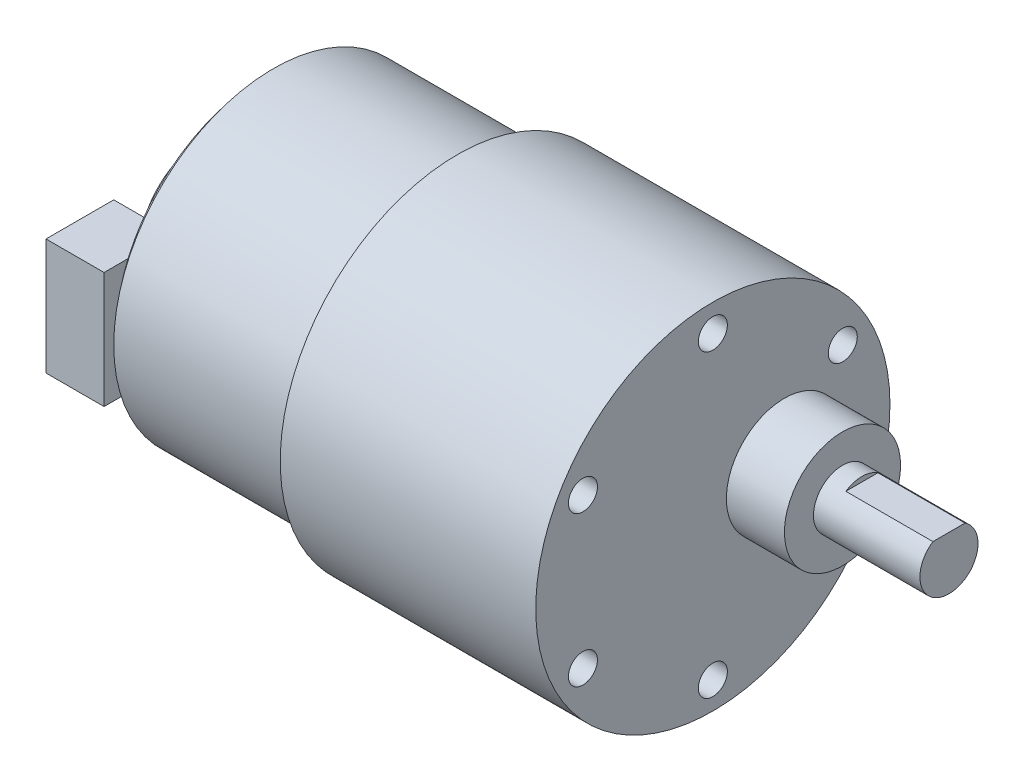
ISO-10303-21;
HEADER;
FILE_DESCRIPTION(('STEP AP214'),'2;1');
FILE_NAME('part.step','',(''),(''),'','','');
FILE_SCHEMA(('AUTOMOTIVE_DESIGN { 1 0 10303 214 1 1 1 1 }'));
ENDSEC;
DATA;
#1=APPLICATION_CONTEXT('core data for automotive mechanical design processes');
#2=APPLICATION_PROTOCOL_DEFINITION('international standard','automotive_design',2000,#1);
#3=PRODUCT_CONTEXT('',#1,'mechanical');
#4=PRODUCT('Part','Part','',(#3));
#5=PRODUCT_RELATED_PRODUCT_CATEGORY('part','',(#4));
#6=PRODUCT_DEFINITION_FORMATION('','',#4);
#7=PRODUCT_DEFINITION_CONTEXT('part definition',#1,'design');
#8=PRODUCT_DEFINITION('design','',#6,#7);
#9=PRODUCT_DEFINITION_SHAPE('','',#8);
#10=(LENGTH_UNIT() NAMED_UNIT(*) SI_UNIT(.MILLI.,.METRE.));
#11=(NAMED_UNIT(*) PLANE_ANGLE_UNIT() SI_UNIT($,.RADIAN.));
#12=(NAMED_UNIT(*) SI_UNIT($,.STERADIAN.) SOLID_ANGLE_UNIT());
#13=UNCERTAINTY_MEASURE_WITH_UNIT(LENGTH_MEASURE(1.E-05),#10,'distance_accuracy_value','');
#14=(GEOMETRIC_REPRESENTATION_CONTEXT(3) GLOBAL_UNCERTAINTY_ASSIGNED_CONTEXT((#13)) GLOBAL_UNIT_ASSIGNED_CONTEXT((#10,
#11,#12)) REPRESENTATION_CONTEXT('',''));
#15=CARTESIAN_POINT('',(0.,0.,0.));
#16=DIRECTION('',(0.,0.,1.));
#17=DIRECTION('',(1.,0.,0.));
#18=AXIS2_PLACEMENT_3D('',#15,#16,#17);
#19=CARTESIAN_POINT('',(-20.,0.,0.));
#20=DIRECTION('',(-1.,0.,0.));
#21=DIRECTION('',(0.,0.,1.));
#22=AXIS2_PLACEMENT_3D('',#19,#20,#21);
#23=PLANE('',#22);
#24=CARTESIAN_POINT('',(-20.,0.,0.));
#25=DIRECTION('',(-1.,0.,0.));
#26=DIRECTION('',(0.,0.,1.));
#27=AXIS2_PLACEMENT_3D('',#24,#25,#26);
#28=CIRCLE('',#27,6.9);
#29=CARTESIAN_POINT('',(-20.,0.,6.9));
#30=VERTEX_POINT('',#29);
#31=EDGE_CURVE('E233',#30,#30,#28,.T.);
#32=ORIENTED_EDGE('',*,*,#31,.F.);
#33=EDGE_LOOP('',(#32));
#34=FACE_BOUND('',#33,.T.);
#35=DIRECTION('',(0.,-1.,0.));
#36=VECTOR('',#35,1.);
#37=CARTESIAN_POINT('',(-20.,-6.,9.5));
#38=LINE('',#37,#36);
#39=CARTESIAN_POINT('',(-20.,6.,9.5));
#40=VERTEX_POINT('',#39);
#41=CARTESIAN_POINT('',(-20.,-6.,9.5));
#42=VERTEX_POINT('',#41);
#43=EDGE_CURVE('E209',#40,#42,#38,.T.);
#44=ORIENTED_EDGE('',*,*,#43,.F.);
#45=DIRECTION('',(0.,0.,1.));
#46=VECTOR('',#45,1.);
#47=CARTESIAN_POINT('',(-20.,6.,0.));
#48=LINE('',#47,#46);
#49=CARTESIAN_POINT('',(-20.,6.,14.02007489281));
#50=VERTEX_POINT('',#49);
#51=EDGE_CURVE('E44',#40,#50,#48,.T.);
#52=ORIENTED_EDGE('',*,*,#51,.T.);
#53=CARTESIAN_POINT('',(-20.,0.,0.));
#54=DIRECTION('',(-1.,0.,0.));
#55=DIRECTION('',(0.,0.,1.));
#56=AXIS2_PLACEMENT_3D('',#53,#54,#55);
#57=CIRCLE('',#56,15.25);
#58=CARTESIAN_POINT('',(-20.,-6.,14.02007489281));
#59=VERTEX_POINT('',#58);
#60=EDGE_CURVE('E238',#50,#59,#57,.T.);
#61=ORIENTED_EDGE('',*,*,#60,.T.);
#62=DIRECTION('',(0.,0.,1.));
#63=VECTOR('',#62,1.);
#64=CARTESIAN_POINT('',(-20.,-6.,9.5));
#65=LINE('',#64,#63);
#66=EDGE_CURVE('E192',#42,#59,#65,.T.);
#67=ORIENTED_EDGE('',*,*,#66,.F.);
#68=EDGE_LOOP('',(#44,#52,#61,#67));
#69=FACE_BOUND('',#68,.T.);
#70=ADVANCED_FACE('F40',(#34,#69),#23,.T.);
#71=CARTESIAN_POINT('',(26.4,0.,0.));
#72=DIRECTION('',(-1.,0.,0.));
#73=DIRECTION('',(0.,0.,1.));
#74=AXIS2_PLACEMENT_3D('',#71,#72,#73);
#75=CYLINDRICAL_SURFACE('',#74,18.3);
#76=CARTESIAN_POINT('',(26.4,0.,0.));
#77=DIRECTION('',(1.,0.,0.));
#78=DIRECTION('',(0.,0.,-1.));
#79=AXIS2_PLACEMENT_3D('',#76,#77,#78);
#80=CIRCLE('',#79,18.3);
#81=CARTESIAN_POINT('',(26.4,0.,-18.3));
#82=VERTEX_POINT('',#81);
#83=EDGE_CURVE('E254',#82,#82,#80,.T.);
#84=ORIENTED_EDGE('',*,*,#83,.F.);
#85=EDGE_LOOP('',(#84));
#86=FACE_BOUND('',#85,.T.);
#87=CARTESIAN_POINT('',(0.,0.,0.));
#88=DIRECTION('',(1.,0.,0.));
#89=DIRECTION('',(0.,0.,-1.));
#90=AXIS2_PLACEMENT_3D('',#87,#88,#89);
#91=CIRCLE('',#90,18.3);
#92=CARTESIAN_POINT('',(0.,0.,-18.3));
#93=VERTEX_POINT('',#92);
#94=EDGE_CURVE('E250',#93,#93,#91,.T.);
#95=ORIENTED_EDGE('',*,*,#94,.T.);
#96=EDGE_LOOP('',(#95));
#97=FACE_BOUND('',#96,.T.);
#98=ADVANCED_FACE('F42',(#86,#97),#75,.T.);
#99=CARTESIAN_POINT('',(26.4,0.,0.));
#100=DIRECTION('',(1.,0.,0.));
#101=DIRECTION('',(0.,0.,-1.));
#102=AXIS2_PLACEMENT_3D('',#99,#100,#101);
#103=PLANE('',#102);
#104=CARTESIAN_POINT('',(26.4,0.,-7.39614994934144));
#105=DIRECTION('',(1.,0.,0.));
#106=DIRECTION('',(0.,0.,-1.));
#107=AXIS2_PLACEMENT_3D('',#104,#105,#106);
#108=CIRCLE('',#107,6.);
#109=CARTESIAN_POINT('',(26.4,0.,-13.3961499493414));
#110=VERTEX_POINT('',#109);
#111=EDGE_CURVE('E126',#110,#110,#108,.T.);
#112=ORIENTED_EDGE('',*,*,#111,.F.);
#113=EDGE_LOOP('',(#112));
#114=FACE_BOUND('',#113,.T.);
#115=CARTESIAN_POINT('',(26.4,15.5000000000001,2.49843971081276E-13));
#116=DIRECTION('',(1.,0.,0.));
#117=DIRECTION('',(0.,0.,-1.));
#118=AXIS2_PLACEMENT_3D('',#115,#116,#117);
#119=CIRCLE('',#118,1.50000000000001);
#120=CARTESIAN_POINT('',(26.4,15.5000000000001,-1.49999999999976));
#121=VERTEX_POINT('',#120);
#122=EDGE_CURVE('E172',#121,#121,#119,.T.);
#123=ORIENTED_EDGE('',*,*,#122,.F.);
#124=EDGE_LOOP('',(#123));
#125=FACE_BOUND('',#124,.T.);
#126=CARTESIAN_POINT('',(26.4,7.75000000000026,-13.4233937586594));
#127=DIRECTION('',(1.,0.,0.));
#128=DIRECTION('',(0.,0.,-1.));
#129=AXIS2_PLACEMENT_3D('',#126,#127,#128);
#130=CIRCLE('',#129,1.49999999999935);
#131=CARTESIAN_POINT('',(26.4,7.75000000000026,-14.9233937586588));
#132=VERTEX_POINT('',#131);
#133=EDGE_CURVE('E164',#132,#132,#130,.T.);
#134=ORIENTED_EDGE('',*,*,#133,.F.);
#135=EDGE_LOOP('',(#134));
#136=FACE_BOUND('',#135,.T.);
#137=CARTESIAN_POINT('',(26.4,-7.75000000000041,-13.42339375866));
#138=DIRECTION('',(1.,0.,0.));
#139=DIRECTION('',(0.,0.,-1.));
#140=AXIS2_PLACEMENT_3D('',#137,#138,#139);
#141=CIRCLE('',#140,1.49999999999888);
#142=CARTESIAN_POINT('',(26.4,-7.75000000000041,-14.9233937586589));
#143=VERTEX_POINT('',#142);
#144=EDGE_CURVE('E156',#143,#143,#141,.T.);
#145=ORIENTED_EDGE('',*,*,#144,.F.);
#146=EDGE_LOOP('',(#145));
#147=FACE_BOUND('',#146,.T.);
#148=CARTESIAN_POINT('',(26.4,-15.5000000000012,-8.8644904428813E-13));
#149=DIRECTION('',(1.,0.,0.));
#150=DIRECTION('',(0.,0.,-1.));
#151=AXIS2_PLACEMENT_3D('',#148,#149,#150);
#152=CIRCLE('',#151,1.49999999999904);
#153=CARTESIAN_POINT('',(26.4,-15.5000000000012,-1.49999999999992));
#154=VERTEX_POINT('',#153);
#155=EDGE_CURVE('E148',#154,#154,#152,.T.);
#156=ORIENTED_EDGE('',*,*,#155,.F.);
#157=EDGE_LOOP('',(#156));
#158=FACE_BOUND('',#157,.T.);
#159=CARTESIAN_POINT('',(26.4,-7.75000000000139,13.4233937586588));
#160=DIRECTION('',(1.,0.,0.));
#161=DIRECTION('',(0.,0.,-1.));
#162=AXIS2_PLACEMENT_3D('',#159,#160,#161);
#163=CIRCLE('',#162,1.49999999999967);
#164=CARTESIAN_POINT('',(26.4,-7.75000000000139,11.9233937586591));
#165=VERTEX_POINT('',#164);
#166=EDGE_CURVE('E139',#165,#165,#163,.T.);
#167=ORIENTED_EDGE('',*,*,#166,.F.);
#168=EDGE_LOOP('',(#167));
#169=FACE_BOUND('',#168,.T.);
#170=CARTESIAN_POINT('',(26.4,7.74999999999928,13.4233937586593));
#171=DIRECTION('',(1.,0.,0.));
#172=DIRECTION('',(0.,0.,-1.));
#173=AXIS2_PLACEMENT_3D('',#170,#171,#172);
#174=CIRCLE('',#173,1.50000000000014);
#175=CARTESIAN_POINT('',(26.4,7.74999999999928,11.9233937586592));
#176=VERTEX_POINT('',#175);
#177=EDGE_CURVE('E143',#176,#176,#174,.T.);
#178=ORIENTED_EDGE('',*,*,#177,.F.);
#179=EDGE_LOOP('',(#178));
#180=FACE_BOUND('',#179,.T.);
#181=ORIENTED_EDGE('',*,*,#83,.T.);
#182=EDGE_LOOP('',(#181));
#183=FACE_BOUND('',#182,.T.);
#184=ADVANCED_FACE('F265',(#114,#125,#136,#147,#158,#169,#180,#183),#103,.T.);
#185=CARTESIAN_POINT('',(0.,0.,0.));
#186=DIRECTION('',(1.,0.,0.));
#187=DIRECTION('',(0.,0.,-1.));
#188=AXIS2_PLACEMENT_3D('',#185,#186,#187);
#189=PLANE('',#188);
#190=CARTESIAN_POINT('',(0.,0.,0.));
#191=DIRECTION('',(-1.,0.,0.));
#192=DIRECTION('',(0.,0.,1.));
#193=AXIS2_PLACEMENT_3D('',#190,#191,#192);
#194=CIRCLE('',#193,16.5);
#195=CARTESIAN_POINT('',(0.,0.,16.5));
#196=VERTEX_POINT('',#195);
#197=EDGE_CURVE('E246',#196,#196,#194,.T.);
#198=ORIENTED_EDGE('',*,*,#197,.F.);
#199=EDGE_LOOP('',(#198));
#200=FACE_BOUND('',#199,.T.);
#201=ORIENTED_EDGE('',*,*,#94,.F.);
#202=EDGE_LOOP('',(#201));
#203=FACE_BOUND('',#202,.T.);
#204=ADVANCED_FACE('F262',(#200,#203),#189,.F.);
#205=CARTESIAN_POINT('',(-19.,0.,0.));
#206=DIRECTION('',(1.,0.,0.));
#207=DIRECTION('',(0.,0.,-1.));
#208=AXIS2_PLACEMENT_3D('',#205,#206,#207);
#209=CYLINDRICAL_SURFACE('',#208,16.5);
#210=CARTESIAN_POINT('',(-19.,0.,0.));
#211=DIRECTION('',(-1.,0.,0.));
#212=DIRECTION('',(0.,0.,1.));
#213=AXIS2_PLACEMENT_3D('',#210,#211,#212);
#214=CIRCLE('',#213,16.5);
#215=CARTESIAN_POINT('',(-19.,0.,16.5));
#216=VERTEX_POINT('',#215);
#217=EDGE_CURVE('E242',#216,#216,#214,.T.);
#218=ORIENTED_EDGE('',*,*,#217,.F.);
#219=EDGE_LOOP('',(#218));
#220=FACE_BOUND('',#219,.T.);
#221=ORIENTED_EDGE('',*,*,#197,.T.);
#222=EDGE_LOOP('',(#221));
#223=FACE_BOUND('',#222,.T.);
#224=ADVANCED_FACE('F264',(#220,#223),#209,.T.);
#225=CARTESIAN_POINT('',(-19.,0.,0.));
#226=DIRECTION('',(-1.,0.,0.));
#227=DIRECTION('',(0.,0.,1.));
#228=AXIS2_PLACEMENT_3D('',#225,#226,#227);
#229=PLANE('',#228);
#230=CARTESIAN_POINT('',(-19.,0.,0.));
#231=DIRECTION('',(-1.,0.,0.));
#232=DIRECTION('',(0.,0.,1.));
#233=AXIS2_PLACEMENT_3D('',#230,#231,#232);
#234=CIRCLE('',#233,15.25);
#235=CARTESIAN_POINT('',(-19.,0.,15.25));
#236=VERTEX_POINT('',#235);
#237=EDGE_CURVE('E237',#236,#236,#234,.T.);
#238=ORIENTED_EDGE('',*,*,#237,.F.);
#239=EDGE_LOOP('',(#238));
#240=FACE_BOUND('',#239,.T.);
#241=ORIENTED_EDGE('',*,*,#217,.T.);
#242=EDGE_LOOP('',(#241));
#243=FACE_BOUND('',#242,.T.);
#244=ADVANCED_FACE('F271',(#240,#243),#229,.T.);
#245=CARTESIAN_POINT('',(-20.,0.,0.));
#246=DIRECTION('',(1.,0.,0.));
#247=DIRECTION('',(0.,0.,-1.));
#248=AXIS2_PLACEMENT_3D('',#245,#246,#247);
#249=CYLINDRICAL_SURFACE('',#248,15.25);
#250=ORIENTED_EDGE('',*,*,#60,.F.);
#251=EDGE_CURVE('E232',#59,#50,#57,.T.);
#252=ORIENTED_EDGE('',*,*,#251,.F.);
#253=EDGE_LOOP('',(#250,#252));
#254=FACE_BOUND('',#253,.T.);
#255=ORIENTED_EDGE('',*,*,#237,.T.);
#256=EDGE_LOOP('',(#255));
#257=FACE_BOUND('',#256,.T.);
#258=ADVANCED_FACE('F290',(#254,#257),#249,.T.);
#259=CARTESIAN_POINT('',(-26.,0.,0.));
#260=DIRECTION('',(1.,0.,0.));
#261=DIRECTION('',(0.,0.,-1.));
#262=AXIS2_PLACEMENT_3D('',#259,#260,#261);
#263=CYLINDRICAL_SURFACE('',#262,6.9);
#264=CARTESIAN_POINT('',(-26.,0.,0.));
#265=DIRECTION('',(-1.,0.,0.));
#266=DIRECTION('',(0.,0.,1.));
#267=AXIS2_PLACEMENT_3D('',#264,#265,#266);
#268=CIRCLE('',#267,6.9);
#269=CARTESIAN_POINT('',(-26.,0.,6.9));
#270=VERTEX_POINT('',#269);
#271=EDGE_CURVE('E228',#270,#270,#268,.T.);
#272=ORIENTED_EDGE('',*,*,#271,.F.);
#273=EDGE_LOOP('',(#272));
#274=FACE_BOUND('',#273,.T.);
#275=ORIENTED_EDGE('',*,*,#31,.T.);
#276=EDGE_LOOP('',(#275));
#277=FACE_BOUND('',#276,.T.);
#278=ADVANCED_FACE('F288',(#274,#277),#263,.T.);
#279=CARTESIAN_POINT('',(-26.,0.,0.));
#280=DIRECTION('',(-1.,0.,0.));
#281=DIRECTION('',(0.,0.,1.));
#282=AXIS2_PLACEMENT_3D('',#279,#280,#281);
#283=PLANE('',#282);
#284=ORIENTED_EDGE('',*,*,#271,.T.);
#285=EDGE_LOOP('',(#284));
#286=FACE_BOUND('',#285,.T.);
#287=ADVANCED_FACE('F316',(#286),#283,.T.);
#288=CARTESIAN_POINT('',(-26.,-6.,16.5));
#289=DIRECTION('',(0.,0.,-1.));
#290=DIRECTION('',(-1.,0.,0.));
#291=AXIS2_PLACEMENT_3D('',#288,#289,#290);
#292=PLANE('',#291);
#293=DIRECTION('',(0.,1.,0.));
#294=VECTOR('',#293,1.);
#295=CARTESIAN_POINT('',(-20.,-6.,16.5));
#296=LINE('',#295,#294);
#297=CARTESIAN_POINT('',(-20.,-6.,16.5));
#298=VERTEX_POINT('',#297);
#299=CARTESIAN_POINT('',(-20.,6.,16.5));
#300=VERTEX_POINT('',#299);
#301=EDGE_CURVE('E183',#298,#300,#296,.T.);
#302=ORIENTED_EDGE('',*,*,#301,.T.);
#303=DIRECTION('',(1.,0.,0.));
#304=VECTOR('',#303,1.);
#305=CARTESIAN_POINT('',(-26.,6.,16.5));
#306=LINE('',#305,#304);
#307=CARTESIAN_POINT('',(-26.,6.,16.5));
#308=VERTEX_POINT('',#307);
#309=EDGE_CURVE('E224',#308,#300,#306,.T.);
#310=ORIENTED_EDGE('',*,*,#309,.F.);
#311=DIRECTION('',(0.,1.,0.));
#312=VECTOR('',#311,1.);
#313=CARTESIAN_POINT('',(-26.,-6.,16.5));
#314=LINE('',#313,#312);
#315=CARTESIAN_POINT('',(-26.,-6.,16.5));
#316=VERTEX_POINT('',#315);
#317=EDGE_CURVE('E187',#316,#308,#314,.T.);
#318=ORIENTED_EDGE('',*,*,#317,.F.);
#319=DIRECTION('',(1.,0.,0.));
#320=VECTOR('',#319,1.);
#321=CARTESIAN_POINT('',(-26.,-6.,16.5));
#322=LINE('',#321,#320);
#323=EDGE_CURVE('E201',#316,#298,#322,.T.);
#324=ORIENTED_EDGE('',*,*,#323,.T.);
#325=EDGE_LOOP('',(#302,#310,#318,#324));
#326=FACE_BOUND('',#325,.T.);
#327=ADVANCED_FACE('F323',(#326),#292,.F.);
#328=CARTESIAN_POINT('',(-26.,6.,9.5));
#329=DIRECTION('',(0.,-1.,0.));
#330=DIRECTION('',(0.,0.,-1.));
#331=AXIS2_PLACEMENT_3D('',#328,#329,#330);
#332=PLANE('',#331);
#333=DIRECTION('',(0.,0.,-1.));
#334=VECTOR('',#333,1.);
#335=CARTESIAN_POINT('',(-20.,6.,9.5));
#336=LINE('',#335,#334);
#337=EDGE_CURVE('E205',#300,#50,#336,.T.);
#338=ORIENTED_EDGE('',*,*,#337,.T.);
#339=ORIENTED_EDGE('',*,*,#51,.F.);
#340=DIRECTION('',(1.,0.,0.));
#341=VECTOR('',#340,1.);
#342=CARTESIAN_POINT('',(-26.,6.,9.5));
#343=LINE('',#342,#341);
#344=CARTESIAN_POINT('',(-26.,6.,9.5));
#345=VERTEX_POINT('',#344);
#346=EDGE_CURVE('E220',#345,#40,#343,.T.);
#347=ORIENTED_EDGE('',*,*,#346,.F.);
#348=DIRECTION('',(0.,0.,-1.));
#349=VECTOR('',#348,1.);
#350=CARTESIAN_POINT('',(-26.,6.,9.5));
#351=LINE('',#350,#349);
#352=EDGE_CURVE('E191',#308,#345,#351,.T.);
#353=ORIENTED_EDGE('',*,*,#352,.F.);
#354=ORIENTED_EDGE('',*,*,#309,.T.);
#355=EDGE_LOOP('',(#338,#339,#347,#353,#354));
#356=FACE_BOUND('',#355,.T.);
#357=ADVANCED_FACE('F329',(#356),#332,.F.);
#358=CARTESIAN_POINT('',(-26.,-6.,9.5));
#359=DIRECTION('',(0.,0.,1.));
#360=DIRECTION('',(1.,0.,0.));
#361=AXIS2_PLACEMENT_3D('',#358,#359,#360);
#362=PLANE('',#361);
#363=ORIENTED_EDGE('',*,*,#43,.T.);
#364=DIRECTION('',(1.,0.,0.));
#365=VECTOR('',#364,1.);
#366=CARTESIAN_POINT('',(-26.,-6.,9.5));
#367=LINE('',#366,#365);
#368=CARTESIAN_POINT('',(-26.,-6.,9.5));
#369=VERTEX_POINT('',#368);
#370=EDGE_CURVE('E64',#369,#42,#367,.T.);
#371=ORIENTED_EDGE('',*,*,#370,.F.);
#372=DIRECTION('',(0.,-1.,0.));
#373=VECTOR('',#372,1.);
#374=CARTESIAN_POINT('',(-26.,-6.,9.5));
#375=LINE('',#374,#373);
#376=EDGE_CURVE('E195',#345,#369,#375,.T.);
#377=ORIENTED_EDGE('',*,*,#376,.F.);
#378=ORIENTED_EDGE('',*,*,#346,.T.);
#379=EDGE_LOOP('',(#363,#371,#377,#378));
#380=FACE_BOUND('',#379,.T.);
#381=ADVANCED_FACE('F337',(#380),#362,.F.);
#382=CARTESIAN_POINT('',(-26.,-6.,9.5));
#383=DIRECTION('',(0.,1.,0.));
#384=DIRECTION('',(0.,0.,1.));
#385=AXIS2_PLACEMENT_3D('',#382,#383,#384);
#386=PLANE('',#385);
#387=ORIENTED_EDGE('',*,*,#66,.T.);
#388=EDGE_CURVE('E212',#59,#298,#65,.T.);
#389=ORIENTED_EDGE('',*,*,#388,.T.);
#390=ORIENTED_EDGE('',*,*,#323,.F.);
#391=DIRECTION('',(0.,0.,1.));
#392=VECTOR('',#391,1.);
#393=CARTESIAN_POINT('',(-26.,-6.,9.5));
#394=LINE('',#393,#392);
#395=EDGE_CURVE('E198',#369,#316,#394,.T.);
#396=ORIENTED_EDGE('',*,*,#395,.F.);
#397=ORIENTED_EDGE('',*,*,#370,.T.);
#398=EDGE_LOOP('',(#387,#389,#390,#396,#397));
#399=FACE_BOUND('',#398,.T.);
#400=ADVANCED_FACE('F345',(#399),#386,.F.);
#401=CARTESIAN_POINT('',(-26.,0.,0.));
#402=DIRECTION('',(1.,0.,0.));
#403=DIRECTION('',(0.,0.,-1.));
#404=AXIS2_PLACEMENT_3D('',#401,#402,#403);
#405=PLANE('',#404);
#406=ORIENTED_EDGE('',*,*,#317,.T.);
#407=ORIENTED_EDGE('',*,*,#352,.T.);
#408=ORIENTED_EDGE('',*,*,#376,.T.);
#409=ORIENTED_EDGE('',*,*,#395,.T.);
#410=EDGE_LOOP('',(#406,#407,#408,#409));
#411=FACE_BOUND('',#410,.T.);
#412=ADVANCED_FACE('F353',(#411),#405,.F.);
#413=CARTESIAN_POINT('',(-20.,0.,0.));
#414=DIRECTION('',(1.,0.,0.));
#415=DIRECTION('',(0.,0.,-1.));
#416=AXIS2_PLACEMENT_3D('',#413,#414,#415);
#417=PLANE('',#416);
#418=ORIENTED_EDGE('',*,*,#251,.T.);
#419=ORIENTED_EDGE('',*,*,#337,.F.);
#420=ORIENTED_EDGE('',*,*,#301,.F.);
#421=ORIENTED_EDGE('',*,*,#388,.F.);
#422=EDGE_LOOP('',(#418,#419,#420,#421));
#423=FACE_BOUND('',#422,.T.);
#424=ADVANCED_FACE('F360',(#423),#417,.T.);
#425=CARTESIAN_POINT('',(22.4,7.74999999999928,13.4233937586593));
#426=DIRECTION('',(1.,0.,0.));
#427=DIRECTION('',(0.,0.,-1.));
#428=AXIS2_PLACEMENT_3D('',#425,#426,#427);
#429=CYLINDRICAL_SURFACE('',#428,1.50000000000014);
#430=CARTESIAN_POINT('',(22.4,7.74999999999928,13.4233937586593));
#431=DIRECTION('',(1.,0.,0.));
#432=DIRECTION('',(0.,0.,-1.));
#433=AXIS2_PLACEMENT_3D('',#430,#431,#432);
#434=CIRCLE('',#433,1.50000000000014);
#435=CARTESIAN_POINT('',(22.4,7.74999999999928,11.9233937586592));
#436=VERTEX_POINT('',#435);
#437=EDGE_CURVE('E179',#436,#436,#434,.T.);
#438=ORIENTED_EDGE('',*,*,#437,.F.);
#439=EDGE_LOOP('',(#438));
#440=FACE_BOUND('',#439,.T.);
#441=ORIENTED_EDGE('',*,*,#177,.T.);
#442=EDGE_LOOP('',(#441));
#443=FACE_BOUND('',#442,.T.);
#444=ADVANCED_FACE('F368',(#440,#443),#429,.F.);
#445=CARTESIAN_POINT('',(22.4,0.,0.));
#446=DIRECTION('',(1.,0.,0.));
#447=DIRECTION('',(0.,0.,-1.));
#448=AXIS2_PLACEMENT_3D('',#445,#446,#447);
#449=PLANE('',#448);
#450=ORIENTED_EDGE('',*,*,#437,.T.);
#451=EDGE_LOOP('',(#450));
#452=FACE_BOUND('',#451,.T.);
#453=ADVANCED_FACE('F376',(#452),#449,.T.);
#454=CARTESIAN_POINT('',(22.4,-7.75000000000139,13.4233937586588));
#455=DIRECTION('',(1.,0.,0.));
#456=DIRECTION('',(0.,0.,-1.));
#457=AXIS2_PLACEMENT_3D('',#454,#455,#456);
#458=CYLINDRICAL_SURFACE('',#457,1.49999999999967);
#459=CARTESIAN_POINT('',(22.4,-7.75000000000139,13.4233937586588));
#460=DIRECTION('',(1.,0.,0.));
#461=DIRECTION('',(0.,0.,-1.));
#462=AXIS2_PLACEMENT_3D('',#459,#460,#461);
#463=CIRCLE('',#462,1.49999999999967);
#464=CARTESIAN_POINT('',(22.4,-7.75000000000139,11.9233937586591));
#465=VERTEX_POINT('',#464);
#466=EDGE_CURVE('E144',#465,#465,#463,.T.);
#467=ORIENTED_EDGE('',*,*,#466,.F.);
#468=EDGE_LOOP('',(#467));
#469=FACE_BOUND('',#468,.T.);
#470=ORIENTED_EDGE('',*,*,#166,.T.);
#471=EDGE_LOOP('',(#470));
#472=FACE_BOUND('',#471,.T.);
#473=ADVANCED_FACE('F384',(#469,#472),#458,.F.);
#474=CARTESIAN_POINT('',(22.4,0.,0.));
#475=DIRECTION('',(1.,0.,0.));
#476=DIRECTION('',(0.,0.,-1.));
#477=AXIS2_PLACEMENT_3D('',#474,#475,#476);
#478=PLANE('',#477);
#479=ORIENTED_EDGE('',*,*,#466,.T.);
#480=EDGE_LOOP('',(#479));
#481=FACE_BOUND('',#480,.T.);
#482=ADVANCED_FACE('F392',(#481),#478,.T.);
#483=CARTESIAN_POINT('',(22.4,-15.5000000000012,-8.8644904428813E-13));
#484=DIRECTION('',(1.,0.,0.));
#485=DIRECTION('',(0.,0.,-1.));
#486=AXIS2_PLACEMENT_3D('',#483,#484,#485);
#487=CYLINDRICAL_SURFACE('',#486,1.49999999999904);
#488=CARTESIAN_POINT('',(22.4,-15.5000000000012,-8.8644904428813E-13));
#489=DIRECTION('',(1.,0.,0.));
#490=DIRECTION('',(0.,0.,-1.));
#491=AXIS2_PLACEMENT_3D('',#488,#489,#490);
#492=CIRCLE('',#491,1.49999999999904);
#493=CARTESIAN_POINT('',(22.4,-15.5000000000012,-1.49999999999992));
#494=VERTEX_POINT('',#493);
#495=EDGE_CURVE('E152',#494,#494,#492,.T.);
#496=ORIENTED_EDGE('',*,*,#495,.F.);
#497=EDGE_LOOP('',(#496));
#498=FACE_BOUND('',#497,.T.);
#499=ORIENTED_EDGE('',*,*,#155,.T.);
#500=EDGE_LOOP('',(#499));
#501=FACE_BOUND('',#500,.T.);
#502=ADVANCED_FACE('F400',(#498,#501),#487,.F.);
#503=CARTESIAN_POINT('',(22.4,0.,0.));
#504=DIRECTION('',(1.,0.,0.));
#505=DIRECTION('',(0.,0.,-1.));
#506=AXIS2_PLACEMENT_3D('',#503,#504,#505);
#507=PLANE('',#506);
#508=ORIENTED_EDGE('',*,*,#495,.T.);
#509=EDGE_LOOP('',(#508));
#510=FACE_BOUND('',#509,.T.);
#511=ADVANCED_FACE('F408',(#510),#507,.T.);
#512=CARTESIAN_POINT('',(22.4,-7.75000000000041,-13.42339375866));
#513=DIRECTION('',(1.,0.,0.));
#514=DIRECTION('',(0.,0.,-1.));
#515=AXIS2_PLACEMENT_3D('',#512,#513,#514);
#516=CYLINDRICAL_SURFACE('',#515,1.49999999999888);
#517=CARTESIAN_POINT('',(22.4,-7.75000000000041,-13.42339375866));
#518=DIRECTION('',(1.,0.,0.));
#519=DIRECTION('',(0.,0.,-1.));
#520=AXIS2_PLACEMENT_3D('',#517,#518,#519);
#521=CIRCLE('',#520,1.49999999999888);
#522=CARTESIAN_POINT('',(22.4,-7.75000000000041,-14.9233937586589));
#523=VERTEX_POINT('',#522);
#524=EDGE_CURVE('E160',#523,#523,#521,.T.);
#525=ORIENTED_EDGE('',*,*,#524,.F.);
#526=EDGE_LOOP('',(#525));
#527=FACE_BOUND('',#526,.T.);
#528=ORIENTED_EDGE('',*,*,#144,.T.);
#529=EDGE_LOOP('',(#528));
#530=FACE_BOUND('',#529,.T.);
#531=ADVANCED_FACE('F416',(#527,#530),#516,.F.);
#532=CARTESIAN_POINT('',(22.4,0.,0.));
#533=DIRECTION('',(1.,0.,0.));
#534=DIRECTION('',(0.,0.,-1.));
#535=AXIS2_PLACEMENT_3D('',#532,#533,#534);
#536=PLANE('',#535);
#537=ORIENTED_EDGE('',*,*,#524,.T.);
#538=EDGE_LOOP('',(#537));
#539=FACE_BOUND('',#538,.T.);
#540=ADVANCED_FACE('F424',(#539),#536,.T.);
#541=CARTESIAN_POINT('',(22.4,7.75000000000026,-13.4233937586594));
#542=DIRECTION('',(1.,0.,0.));
#543=DIRECTION('',(0.,0.,-1.));
#544=AXIS2_PLACEMENT_3D('',#541,#542,#543);
#545=CYLINDRICAL_SURFACE('',#544,1.49999999999935);
#546=CARTESIAN_POINT('',(22.4,7.75000000000026,-13.4233937586594));
#547=DIRECTION('',(1.,0.,0.));
#548=DIRECTION('',(0.,0.,-1.));
#549=AXIS2_PLACEMENT_3D('',#546,#547,#548);
#550=CIRCLE('',#549,1.49999999999935);
#551=CARTESIAN_POINT('',(22.4,7.75000000000026,-14.9233937586588));
#552=VERTEX_POINT('',#551);
#553=EDGE_CURVE('E168',#552,#552,#550,.T.);
#554=ORIENTED_EDGE('',*,*,#553,.F.);
#555=EDGE_LOOP('',(#554));
#556=FACE_BOUND('',#555,.T.);
#557=ORIENTED_EDGE('',*,*,#133,.T.);
#558=EDGE_LOOP('',(#557));
#559=FACE_BOUND('',#558,.T.);
#560=ADVANCED_FACE('F432',(#556,#559),#545,.F.);
#561=CARTESIAN_POINT('',(22.4,0.,0.));
#562=DIRECTION('',(1.,0.,0.));
#563=DIRECTION('',(0.,0.,-1.));
#564=AXIS2_PLACEMENT_3D('',#561,#562,#563);
#565=PLANE('',#564);
#566=ORIENTED_EDGE('',*,*,#553,.T.);
#567=EDGE_LOOP('',(#566));
#568=FACE_BOUND('',#567,.T.);
#569=ADVANCED_FACE('F440',(#568),#565,.T.);
#570=CARTESIAN_POINT('',(22.4,15.5000000000001,2.49843971081276E-13));
#571=DIRECTION('',(1.,0.,0.));
#572=DIRECTION('',(0.,0.,-1.));
#573=AXIS2_PLACEMENT_3D('',#570,#571,#572);
#574=CYLINDRICAL_SURFACE('',#573,1.50000000000001);
#575=CARTESIAN_POINT('',(22.4,15.5000000000001,2.49843971081276E-13));
#576=DIRECTION('',(1.,0.,0.));
#577=DIRECTION('',(0.,0.,-1.));
#578=AXIS2_PLACEMENT_3D('',#575,#576,#577);
#579=CIRCLE('',#578,1.50000000000001);
#580=CARTESIAN_POINT('',(22.4,15.5000000000001,-1.49999999999976));
#581=VERTEX_POINT('',#580);
#582=EDGE_CURVE('E135',#581,#581,#579,.T.);
#583=ORIENTED_EDGE('',*,*,#582,.F.);
#584=EDGE_LOOP('',(#583));
#585=FACE_BOUND('',#584,.T.);
#586=ORIENTED_EDGE('',*,*,#122,.T.);
#587=EDGE_LOOP('',(#586));
#588=FACE_BOUND('',#587,.T.);
#589=ADVANCED_FACE('F448',(#585,#588),#574,.F.);
#590=CARTESIAN_POINT('',(22.4,15.5000000000001,2.49843971081276E-13));
#591=DIRECTION('',(1.,0.,0.));
#592=DIRECTION('',(0.,0.,-1.));
#593=AXIS2_PLACEMENT_3D('',#590,#591,#592);
#594=PLANE('',#593);
#595=ORIENTED_EDGE('',*,*,#582,.T.);
#596=EDGE_LOOP('',(#595));
#597=FACE_BOUND('',#596,.T.);
#598=ADVANCED_FACE('F456',(#597),#594,.T.);
#599=CARTESIAN_POINT('',(32.4,0.,-7.39614994934144));
#600=DIRECTION('',(-1.,0.,0.));
#601=DIRECTION('',(0.,0.,1.));
#602=AXIS2_PLACEMENT_3D('',#599,#600,#601);
#603=CYLINDRICAL_SURFACE('',#602,6.);
#604=CARTESIAN_POINT('',(32.4,0.,-7.39614994934144));
#605=DIRECTION('',(1.,0.,0.));
#606=DIRECTION('',(0.,0.,-1.));
#607=AXIS2_PLACEMENT_3D('',#604,#605,#606);
#608=CIRCLE('',#607,6.);
#609=CARTESIAN_POINT('',(32.4,0.,-13.3961499493414));
#610=VERTEX_POINT('',#609);
#611=EDGE_CURVE('E131',#610,#610,#608,.T.);
#612=ORIENTED_EDGE('',*,*,#611,.F.);
#613=EDGE_LOOP('',(#612));
#614=FACE_BOUND('',#613,.T.);
#615=ORIENTED_EDGE('',*,*,#111,.T.);
#616=EDGE_LOOP('',(#615));
#617=FACE_BOUND('',#616,.T.);
#618=ADVANCED_FACE('F464',(#614,#617),#603,.T.);
#619=CARTESIAN_POINT('',(32.4,0.,0.));
#620=DIRECTION('',(1.,0.,0.));
#621=DIRECTION('',(0.,0.,-1.));
#622=AXIS2_PLACEMENT_3D('',#619,#620,#621);
#623=PLANE('',#622);
#624=CARTESIAN_POINT('',(32.4,0.,-7.39614994934144));
#625=DIRECTION('',(1.,0.,0.));
#626=DIRECTION('',(0.,0.,-1.));
#627=AXIS2_PLACEMENT_3D('',#624,#625,#626);
#628=CIRCLE('',#627,3.);
#629=CARTESIAN_POINT('',(32.4,0.,-10.3961499493414));
#630=VERTEX_POINT('',#629);
#631=EDGE_CURVE('E11',#630,#630,#628,.T.);
#632=ORIENTED_EDGE('',*,*,#631,.F.);
#633=EDGE_LOOP('',(#632));
#634=FACE_BOUND('',#633,.T.);
#635=ORIENTED_EDGE('',*,*,#611,.T.);
#636=EDGE_LOOP('',(#635));
#637=FACE_BOUND('',#636,.T.);
#638=ADVANCED_FACE('F473',(#634,#637),#623,.T.);
#639=CARTESIAN_POINT('',(34.4,0.,-7.39614994934144));
#640=DIRECTION('',(-1.,0.,0.));
#641=DIRECTION('',(0.,0.,1.));
#642=AXIS2_PLACEMENT_3D('',#639,#640,#641);
#643=CYLINDRICAL_SURFACE('',#642,3.);
#644=CARTESIAN_POINT('',(34.4,0.,-7.39614994934144));
#645=DIRECTION('',(1.,0.,0.));
#646=DIRECTION('',(0.,0.,-1.));
#647=AXIS2_PLACEMENT_3D('',#644,#645,#646);
#648=CIRCLE('',#647,3.);
#649=CARTESIAN_POINT('',(34.4,2.50006684943398,-9.05436156079555));
#650=VERTEX_POINT('',#649);
#651=CARTESIAN_POINT('',(34.4,2.50006684943398,-5.73793833788734));
#652=VERTEX_POINT('',#651);
#653=EDGE_CURVE('E121',#650,#652,#648,.T.);
#654=ORIENTED_EDGE('',*,*,#653,.F.);
#655=DIRECTION('',(-1.,0.,0.));
#656=VECTOR('',#655,1.);
#657=CARTESIAN_POINT('',(43.4,2.50006684943398,-9.05436156079555));
#658=LINE('',#657,#656);
#659=CARTESIAN_POINT('',(43.4,2.50006684943398,-9.05436156079555));
#660=VERTEX_POINT('',#659);
#661=EDGE_CURVE('E107',#660,#650,#658,.T.);
#662=ORIENTED_EDGE('',*,*,#661,.F.);
#663=CARTESIAN_POINT('',(43.4,0.,-7.39614994934144));
#664=DIRECTION('',(1.,0.,0.));
#665=DIRECTION('',(0.,0.,-1.));
#666=AXIS2_PLACEMENT_3D('',#663,#664,#665);
#667=CIRCLE('',#666,3.);
#668=CARTESIAN_POINT('',(43.4,2.50006684943398,-5.73793833788734));
#669=VERTEX_POINT('',#668);
#670=EDGE_CURVE('E113',#669,#660,#667,.T.);
#671=ORIENTED_EDGE('',*,*,#670,.F.);
#672=DIRECTION('',(-1.,0.,0.));
#673=VECTOR('',#672,1.);
#674=CARTESIAN_POINT('',(43.4,2.50006684943398,-5.73793833788734));
#675=LINE('',#674,#673);
#676=EDGE_CURVE('E109',#669,#652,#675,.T.);
#677=ORIENTED_EDGE('',*,*,#676,.T.);
#678=EDGE_LOOP('',(#654,#662,#671,#677));
#679=FACE_BOUND('',#678,.T.);
#680=ORIENTED_EDGE('',*,*,#631,.T.);
#681=EDGE_LOOP('',(#680));
#682=FACE_BOUND('',#681,.T.);
#683=ADVANCED_FACE('F119',(#679,#682),#643,.T.);
#684=CARTESIAN_POINT('',(34.4,0.,-7.39614994934144));
#685=DIRECTION('',(1.,0.,0.));
#686=DIRECTION('',(0.,0.,-1.));
#687=AXIS2_PLACEMENT_3D('',#684,#685,#686);
#688=PLANE('',#687);
#689=DIRECTION('',(0.,0.,1.));
#690=VECTOR('',#689,1.);
#691=CARTESIAN_POINT('',(34.4,2.50006684943398,-5.73793833788734));
#692=LINE('',#691,#690);
#693=EDGE_CURVE('E56',#650,#652,#692,.T.);
#694=ORIENTED_EDGE('',*,*,#693,.F.);
#695=ORIENTED_EDGE('',*,*,#653,.T.);
#696=EDGE_LOOP('',(#694,#695));
#697=FACE_BOUND('',#696,.T.);
#698=ADVANCED_FACE('F488',(#697),#688,.T.);
#699=CARTESIAN_POINT('',(43.4,2.50006684943398,-5.73793833788734));
#700=DIRECTION('',(0.,-1.,0.));
#701=DIRECTION('',(0.,0.,-1.));
#702=AXIS2_PLACEMENT_3D('',#699,#700,#701);
#703=PLANE('',#702);
#704=ORIENTED_EDGE('',*,*,#693,.T.);
#705=ORIENTED_EDGE('',*,*,#676,.F.);
#706=DIRECTION('',(0.,0.,1.));
#707=VECTOR('',#706,1.);
#708=CARTESIAN_POINT('',(43.4,2.50006684943398,-5.73793833788734));
#709=LINE('',#708,#707);
#710=EDGE_CURVE('E103',#660,#669,#709,.T.);
#711=ORIENTED_EDGE('',*,*,#710,.F.);
#712=ORIENTED_EDGE('',*,*,#661,.T.);
#713=EDGE_LOOP('',(#704,#705,#711,#712));
#714=FACE_BOUND('',#713,.T.);
#715=ADVANCED_FACE('F105',(#714),#703,.F.);
#716=CARTESIAN_POINT('',(43.4,0.,-7.39614994934144));
#717=DIRECTION('',(1.,0.,0.));
#718=DIRECTION('',(0.,0.,-1.));
#719=AXIS2_PLACEMENT_3D('',#716,#717,#718);
#720=PLANE('',#719);
#721=ORIENTED_EDGE('',*,*,#670,.T.);
#722=ORIENTED_EDGE('',*,*,#710,.T.);
#723=EDGE_LOOP('',(#721,#722));
#724=FACE_BOUND('',#723,.T.);
#725=ADVANCED_FACE('F115',(#724),#720,.T.);
#726=CLOSED_SHELL('',(#70,#98,#184,#204,#224,#244,#258,#278,#287,#327,#357,#381,#400,#412,#424,
#444,#453,#473,#482,#502,#511,#531,#540,#560,#569,#589,#598,#618,#638,#683,#698,#715,#725));
#727=MANIFOLD_SOLID_BREP('B2',#726);
#728=ADVANCED_BREP_SHAPE_REPRESENTATION('',(#18,#727),#14);
#729=SHAPE_DEFINITION_REPRESENTATION(#9,#728);
ENDSEC;
END-ISO-10303-21;
